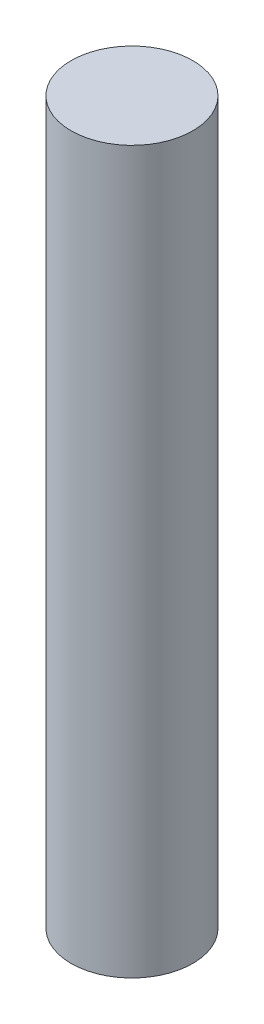
ISO-10303-21;
HEADER;
FILE_DESCRIPTION(('STEP AP214'),'2;1');
FILE_NAME('part.step','',(''),(''),'','','');
FILE_SCHEMA(('AUTOMOTIVE_DESIGN { 1 0 10303 214 1 1 1 1 }'));
ENDSEC;
DATA;
#1=APPLICATION_CONTEXT('core data for automotive mechanical design processes');
#2=APPLICATION_PROTOCOL_DEFINITION('international standard','automotive_design',2000,#1);
#3=PRODUCT_CONTEXT('',#1,'mechanical');
#4=PRODUCT('Part','Part','',(#3));
#5=PRODUCT_RELATED_PRODUCT_CATEGORY('part','',(#4));
#6=PRODUCT_DEFINITION_FORMATION('','',#4);
#7=PRODUCT_DEFINITION_CONTEXT('part definition',#1,'design');
#8=PRODUCT_DEFINITION('design','',#6,#7);
#9=PRODUCT_DEFINITION_SHAPE('','',#8);
#10=(LENGTH_UNIT() NAMED_UNIT(*) SI_UNIT(.MILLI.,.METRE.));
#11=(NAMED_UNIT(*) PLANE_ANGLE_UNIT() SI_UNIT($,.RADIAN.));
#12=(NAMED_UNIT(*) SI_UNIT($,.STERADIAN.) SOLID_ANGLE_UNIT());
#13=UNCERTAINTY_MEASURE_WITH_UNIT(LENGTH_MEASURE(1.E-05),#10,'distance_accuracy_value','');
#14=(GEOMETRIC_REPRESENTATION_CONTEXT(3) GLOBAL_UNCERTAINTY_ASSIGNED_CONTEXT((#13)) GLOBAL_UNIT_ASSIGNED_CONTEXT((#10,
#11,#12)) REPRESENTATION_CONTEXT('',''));
#15=CARTESIAN_POINT('',(0.,0.,0.));
#16=DIRECTION('',(0.,0.,1.));
#17=DIRECTION('',(1.,0.,0.));
#18=AXIS2_PLACEMENT_3D('',#15,#16,#17);
#19=CARTESIAN_POINT('',(0.,16.,0.));
#20=DIRECTION('',(0.,-1.,0.));
#21=DIRECTION('',(0.,0.,-1.));
#22=AXIS2_PLACEMENT_3D('',#19,#20,#21);
#23=CYLINDRICAL_SURFACE('',#22,1.35);
#24=CARTESIAN_POINT('',(0.,16.,0.));
#25=DIRECTION('',(0.,1.,0.));
#26=DIRECTION('',(0.,0.,1.));
#27=AXIS2_PLACEMENT_3D('',#24,#25,#26);
#28=CIRCLE('',#27,1.35);
#29=CARTESIAN_POINT('',(0.,16.,1.35));
#30=VERTEX_POINT('',#29);
#31=EDGE_CURVE('E10',#30,#30,#28,.T.);
#32=ORIENTED_EDGE('',*,*,#31,.F.);
#33=EDGE_LOOP('',(#32));
#34=FACE_BOUND('',#33,.T.);
#35=CARTESIAN_POINT('',(0.,0.,0.));
#36=DIRECTION('',(0.,1.,0.));
#37=DIRECTION('',(0.,0.,1.));
#38=AXIS2_PLACEMENT_3D('',#35,#36,#37);
#39=CIRCLE('',#38,1.35);
#40=CARTESIAN_POINT('',(0.,0.,1.35));
#41=VERTEX_POINT('',#40);
#42=EDGE_CURVE('E46',#41,#41,#39,.T.);
#43=ORIENTED_EDGE('',*,*,#42,.T.);
#44=EDGE_LOOP('',(#43));
#45=FACE_BOUND('',#44,.T.);
#46=ADVANCED_FACE('F43',(#34,#45),#23,.T.);
#47=CARTESIAN_POINT('',(0.,16.,0.));
#48=DIRECTION('',(0.,1.,0.));
#49=DIRECTION('',(0.,0.,1.));
#50=AXIS2_PLACEMENT_3D('',#47,#48,#49);
#51=PLANE('',#50);
#52=ORIENTED_EDGE('',*,*,#31,.T.);
#53=EDGE_LOOP('',(#52));
#54=FACE_BOUND('',#53,.T.);
#55=ADVANCED_FACE('F60',(#54),#51,.T.);
#56=CARTESIAN_POINT('',(0.,0.,0.));
#57=DIRECTION('',(0.,1.,0.));
#58=DIRECTION('',(0.,0.,1.));
#59=AXIS2_PLACEMENT_3D('',#56,#57,#58);
#60=PLANE('',#59);
#61=ORIENTED_EDGE('',*,*,#42,.F.);
#62=EDGE_LOOP('',(#61));
#63=FACE_BOUND('',#62,.T.);
#64=ADVANCED_FACE('F58',(#63),#60,.F.);
#65=CLOSED_SHELL('',(#46,#55,#64));
#66=MANIFOLD_SOLID_BREP('B2',#65);
#67=ADVANCED_BREP_SHAPE_REPRESENTATION('',(#18,#66),#14);
#68=SHAPE_DEFINITION_REPRESENTATION(#9,#67);
ENDSEC;
END-ISO-10303-21;
